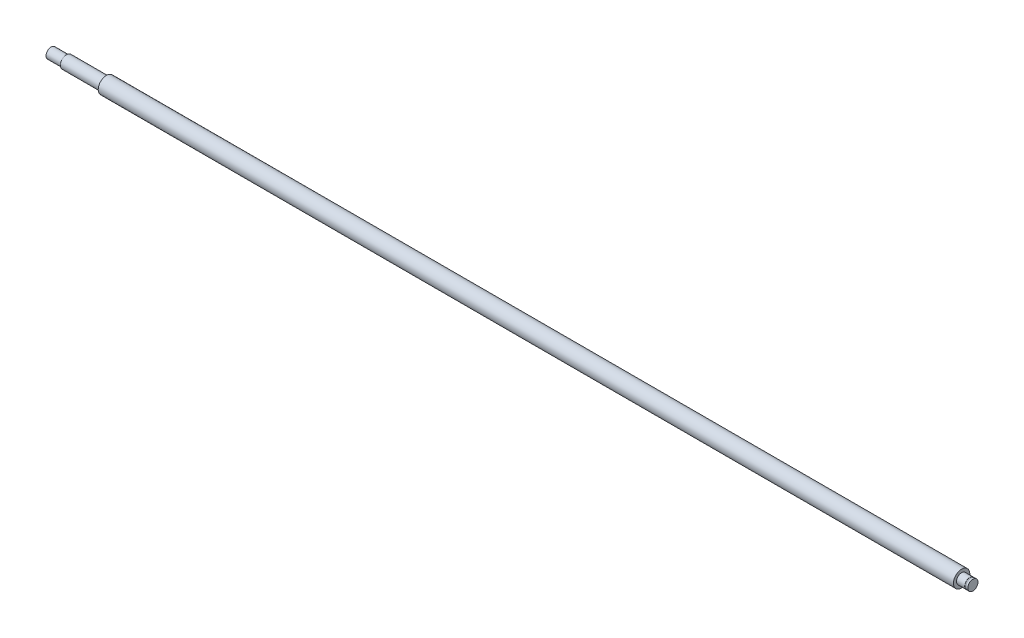
ISO-10303-21;
HEADER;
FILE_DESCRIPTION(('STEP AP214'),'2;1');
FILE_NAME('part.step','',(''),(''),'','','');
FILE_SCHEMA(('AUTOMOTIVE_DESIGN { 1 0 10303 214 1 1 1 1 }'));
ENDSEC;
DATA;
#1=APPLICATION_CONTEXT('core data for automotive mechanical design processes');
#2=APPLICATION_PROTOCOL_DEFINITION('international standard','automotive_design',2000,#1);
#3=PRODUCT_CONTEXT('',#1,'mechanical');
#4=PRODUCT('Part','Part','',(#3));
#5=PRODUCT_RELATED_PRODUCT_CATEGORY('part','',(#4));
#6=PRODUCT_DEFINITION_FORMATION('','',#4);
#7=PRODUCT_DEFINITION_CONTEXT('part definition',#1,'design');
#8=PRODUCT_DEFINITION('design','',#6,#7);
#9=PRODUCT_DEFINITION_SHAPE('','',#8);
#10=(LENGTH_UNIT() NAMED_UNIT(*) SI_UNIT(.MILLI.,.METRE.));
#11=(NAMED_UNIT(*) PLANE_ANGLE_UNIT() SI_UNIT($,.RADIAN.));
#12=(NAMED_UNIT(*) SI_UNIT($,.STERADIAN.) SOLID_ANGLE_UNIT());
#13=UNCERTAINTY_MEASURE_WITH_UNIT(LENGTH_MEASURE(1.E-05),#10,'distance_accuracy_value','');
#14=(GEOMETRIC_REPRESENTATION_CONTEXT(3) GLOBAL_UNCERTAINTY_ASSIGNED_CONTEXT((#13)) GLOBAL_UNIT_ASSIGNED_CONTEXT((#10,
#11,#12)) REPRESENTATION_CONTEXT('',''));
#15=CARTESIAN_POINT('',(0.,0.,0.));
#16=DIRECTION('',(0.,0.,1.));
#17=DIRECTION('',(1.,0.,0.));
#18=AXIS2_PLACEMENT_3D('',#15,#16,#17);
#19=CARTESIAN_POINT('',(0.,0.,0.));
#20=DIRECTION('',(1.,0.,0.));
#21=DIRECTION('',(0.,0.,-1.));
#22=AXIS2_PLACEMENT_3D('',#19,#20,#21);
#23=PLANE('',#22);
#24=CARTESIAN_POINT('',(0.,0.,0.));
#25=DIRECTION('',(-1.,0.,0.));
#26=DIRECTION('',(0.,0.,1.));
#27=AXIS2_PLACEMENT_3D('',#24,#25,#26);
#28=CIRCLE('',#27,5.);
#29=CARTESIAN_POINT('',(0.,0.,5.));
#30=VERTEX_POINT('',#29);
#31=EDGE_CURVE('E10',#30,#30,#28,.T.);
#32=ORIENTED_EDGE('',*,*,#31,.T.);
#33=EDGE_LOOP('',(#32));
#34=FACE_BOUND('',#33,.T.);
#35=ADVANCED_FACE('F39',(#34),#23,.F.);
#36=CARTESIAN_POINT('',(0.,0.,0.));
#37=DIRECTION('',(-1.,0.,0.));
#38=DIRECTION('',(0.,0.,1.));
#39=AXIS2_PLACEMENT_3D('',#36,#37,#38);
#40=CYLINDRICAL_SURFACE('',#39,5.);
#41=ORIENTED_EDGE('',*,*,#31,.F.);
#42=EDGE_LOOP('',(#41));
#43=FACE_BOUND('',#42,.T.);
#44=CARTESIAN_POINT('',(15.,0.,0.));
#45=DIRECTION('',(-1.,0.,0.));
#46=DIRECTION('',(0.,0.,1.));
#47=AXIS2_PLACEMENT_3D('',#44,#45,#46);
#48=CIRCLE('',#47,5.);
#49=CARTESIAN_POINT('',(15.,0.,5.));
#50=VERTEX_POINT('',#49);
#51=EDGE_CURVE('E45',#50,#50,#48,.T.);
#52=ORIENTED_EDGE('',*,*,#51,.T.);
#53=EDGE_LOOP('',(#52));
#54=FACE_BOUND('',#53,.T.);
#55=ADVANCED_FACE('F95',(#43,#54),#40,.T.);
#56=CARTESIAN_POINT('',(15.,5.,0.));
#57=DIRECTION('',(1.,0.,0.));
#58=DIRECTION('',(0.,0.,-1.));
#59=AXIS2_PLACEMENT_3D('',#56,#57,#58);
#60=PLANE('',#59);
#61=ORIENTED_EDGE('',*,*,#51,.F.);
#62=EDGE_LOOP('',(#61));
#63=FACE_BOUND('',#62,.T.);
#64=CARTESIAN_POINT('',(15.,0.,0.));
#65=DIRECTION('',(-1.,0.,0.));
#66=DIRECTION('',(0.,0.,1.));
#67=AXIS2_PLACEMENT_3D('',#64,#65,#66);
#68=CIRCLE('',#67,6.);
#69=CARTESIAN_POINT('',(15.,0.,6.));
#70=VERTEX_POINT('',#69);
#71=EDGE_CURVE('E49',#70,#70,#68,.T.);
#72=ORIENTED_EDGE('',*,*,#71,.T.);
#73=EDGE_LOOP('',(#72));
#74=FACE_BOUND('',#73,.T.);
#75=ADVANCED_FACE('F99',(#63,#74),#60,.F.);
#76=CARTESIAN_POINT('',(0.,0.,0.));
#77=DIRECTION('',(-1.,0.,0.));
#78=DIRECTION('',(0.,0.,1.));
#79=AXIS2_PLACEMENT_3D('',#76,#77,#78);
#80=CYLINDRICAL_SURFACE('',#79,6.);
#81=ORIENTED_EDGE('',*,*,#71,.F.);
#82=EDGE_LOOP('',(#81));
#83=FACE_BOUND('',#82,.T.);
#84=CARTESIAN_POINT('',(54.,0.,0.));
#85=DIRECTION('',(-1.,0.,0.));
#86=DIRECTION('',(0.,0.,1.));
#87=AXIS2_PLACEMENT_3D('',#84,#85,#86);
#88=CIRCLE('',#87,6.);
#89=CARTESIAN_POINT('',(54.,0.,6.));
#90=VERTEX_POINT('',#89);
#91=EDGE_CURVE('E53',#90,#90,#88,.T.);
#92=ORIENTED_EDGE('',*,*,#91,.T.);
#93=EDGE_LOOP('',(#92));
#94=FACE_BOUND('',#93,.T.);
#95=ADVANCED_FACE('F104',(#83,#94),#80,.T.);
#96=CARTESIAN_POINT('',(54.,6.,0.));
#97=DIRECTION('',(1.,0.,0.));
#98=DIRECTION('',(0.,0.,-1.));
#99=AXIS2_PLACEMENT_3D('',#96,#97,#98);
#100=PLANE('',#99);
#101=ORIENTED_EDGE('',*,*,#91,.F.);
#102=EDGE_LOOP('',(#101));
#103=FACE_BOUND('',#102,.T.);
#104=CARTESIAN_POINT('',(54.,0.,0.));
#105=DIRECTION('',(-1.,0.,0.));
#106=DIRECTION('',(0.,0.,1.));
#107=AXIS2_PLACEMENT_3D('',#104,#105,#106);
#108=CIRCLE('',#107,8.);
#109=CARTESIAN_POINT('',(54.,0.,8.));
#110=VERTEX_POINT('',#109);
#111=EDGE_CURVE('E58',#110,#110,#108,.T.);
#112=ORIENTED_EDGE('',*,*,#111,.T.);
#113=EDGE_LOOP('',(#112));
#114=FACE_BOUND('',#113,.T.);
#115=ADVANCED_FACE('F110',(#103,#114),#100,.F.);
#116=CARTESIAN_POINT('',(0.,0.,0.));
#117=DIRECTION('',(-1.,0.,0.));
#118=DIRECTION('',(0.,0.,1.));
#119=AXIS2_PLACEMENT_3D('',#116,#117,#118);
#120=CYLINDRICAL_SURFACE('',#119,8.);
#121=ORIENTED_EDGE('',*,*,#111,.F.);
#122=EDGE_LOOP('',(#121));
#123=FACE_BOUND('',#122,.T.);
#124=CARTESIAN_POINT('',(889.,0.,0.));
#125=DIRECTION('',(-1.,0.,0.));
#126=DIRECTION('',(0.,0.,1.));
#127=AXIS2_PLACEMENT_3D('',#124,#125,#126);
#128=CIRCLE('',#127,8.);
#129=CARTESIAN_POINT('',(889.,0.,8.));
#130=VERTEX_POINT('',#129);
#131=EDGE_CURVE('E61',#130,#130,#128,.T.);
#132=ORIENTED_EDGE('',*,*,#131,.T.);
#133=EDGE_LOOP('',(#132));
#134=FACE_BOUND('',#133,.T.);
#135=ADVANCED_FACE('F114',(#123,#134),#120,.T.);
#136=CARTESIAN_POINT('',(889.,8.,0.));
#137=DIRECTION('',(-1.,0.,0.));
#138=DIRECTION('',(0.,0.,1.));
#139=AXIS2_PLACEMENT_3D('',#136,#137,#138);
#140=PLANE('',#139);
#141=ORIENTED_EDGE('',*,*,#131,.F.);
#142=EDGE_LOOP('',(#141));
#143=FACE_BOUND('',#142,.T.);
#144=CARTESIAN_POINT('',(889.,0.,0.));
#145=DIRECTION('',(-1.,0.,0.));
#146=DIRECTION('',(0.,0.,1.));
#147=AXIS2_PLACEMENT_3D('',#144,#145,#146);
#148=CIRCLE('',#147,5.);
#149=CARTESIAN_POINT('',(889.,0.,5.));
#150=VERTEX_POINT('',#149);
#151=EDGE_CURVE('E64',#150,#150,#148,.T.);
#152=ORIENTED_EDGE('',*,*,#151,.T.);
#153=EDGE_LOOP('',(#152));
#154=FACE_BOUND('',#153,.T.);
#155=ADVANCED_FACE('F118',(#143,#154),#140,.F.);
#156=CARTESIAN_POINT('',(0.,0.,0.));
#157=DIRECTION('',(-1.,0.,0.));
#158=DIRECTION('',(0.,0.,1.));
#159=AXIS2_PLACEMENT_3D('',#156,#157,#158);
#160=CYLINDRICAL_SURFACE('',#159,5.);
#161=ORIENTED_EDGE('',*,*,#151,.F.);
#162=EDGE_LOOP('',(#161));
#163=FACE_BOUND('',#162,.T.);
#164=CARTESIAN_POINT('',(897.,0.,0.));
#165=DIRECTION('',(-1.,0.,0.));
#166=DIRECTION('',(0.,0.,1.));
#167=AXIS2_PLACEMENT_3D('',#164,#165,#166);
#168=CIRCLE('',#167,5.);
#169=CARTESIAN_POINT('',(897.,0.,5.));
#170=VERTEX_POINT('',#169);
#171=EDGE_CURVE('E67',#170,#170,#168,.T.);
#172=ORIENTED_EDGE('',*,*,#171,.T.);
#173=EDGE_LOOP('',(#172));
#174=FACE_BOUND('',#173,.T.);
#175=ADVANCED_FACE('F122',(#163,#174),#160,.T.);
#176=CARTESIAN_POINT('',(897.,5.,0.));
#177=DIRECTION('',(-1.,0.,0.));
#178=DIRECTION('',(0.,0.,1.));
#179=AXIS2_PLACEMENT_3D('',#176,#177,#178);
#180=PLANE('',#179);
#181=ORIENTED_EDGE('',*,*,#171,.F.);
#182=EDGE_LOOP('',(#181));
#183=FACE_BOUND('',#182,.T.);
#184=CARTESIAN_POINT('',(897.,0.,0.));
#185=DIRECTION('',(-1.,0.,0.));
#186=DIRECTION('',(0.,0.,1.));
#187=AXIS2_PLACEMENT_3D('',#184,#185,#186);
#188=CIRCLE('',#187,4.8);
#189=CARTESIAN_POINT('',(897.,0.,4.8));
#190=VERTEX_POINT('',#189);
#191=EDGE_CURVE('E70',#190,#190,#188,.T.);
#192=ORIENTED_EDGE('',*,*,#191,.T.);
#193=EDGE_LOOP('',(#192));
#194=FACE_BOUND('',#193,.T.);
#195=ADVANCED_FACE('F126',(#183,#194),#180,.F.);
#196=CARTESIAN_POINT('',(0.,0.,0.));
#197=DIRECTION('',(-1.,0.,0.));
#198=DIRECTION('',(0.,0.,1.));
#199=AXIS2_PLACEMENT_3D('',#196,#197,#198);
#200=CYLINDRICAL_SURFACE('',#199,4.8);
#201=ORIENTED_EDGE('',*,*,#191,.F.);
#202=EDGE_LOOP('',(#201));
#203=FACE_BOUND('',#202,.T.);
#204=CARTESIAN_POINT('',(898.15,0.,0.));
#205=DIRECTION('',(-1.,0.,0.));
#206=DIRECTION('',(0.,0.,1.));
#207=AXIS2_PLACEMENT_3D('',#204,#205,#206);
#208=CIRCLE('',#207,4.8);
#209=CARTESIAN_POINT('',(898.15,0.,4.8));
#210=VERTEX_POINT('',#209);
#211=EDGE_CURVE('E73',#210,#210,#208,.T.);
#212=ORIENTED_EDGE('',*,*,#211,.T.);
#213=EDGE_LOOP('',(#212));
#214=FACE_BOUND('',#213,.T.);
#215=ADVANCED_FACE('F130',(#203,#214),#200,.T.);
#216=CARTESIAN_POINT('',(898.15,4.8,0.));
#217=DIRECTION('',(1.,0.,0.));
#218=DIRECTION('',(0.,0.,-1.));
#219=AXIS2_PLACEMENT_3D('',#216,#217,#218);
#220=PLANE('',#219);
#221=ORIENTED_EDGE('',*,*,#211,.F.);
#222=EDGE_LOOP('',(#221));
#223=FACE_BOUND('',#222,.T.);
#224=CARTESIAN_POINT('',(898.15,0.,0.));
#225=DIRECTION('',(-1.,0.,0.));
#226=DIRECTION('',(0.,0.,1.));
#227=AXIS2_PLACEMENT_3D('',#224,#225,#226);
#228=CIRCLE('',#227,5.);
#229=CARTESIAN_POINT('',(898.15,0.,5.));
#230=VERTEX_POINT('',#229);
#231=EDGE_CURVE('E76',#230,#230,#228,.T.);
#232=ORIENTED_EDGE('',*,*,#231,.T.);
#233=EDGE_LOOP('',(#232));
#234=FACE_BOUND('',#233,.T.);
#235=ADVANCED_FACE('F91',(#223,#234),#220,.F.);
#236=CARTESIAN_POINT('',(0.,0.,0.));
#237=DIRECTION('',(-1.,0.,0.));
#238=DIRECTION('',(0.,0.,1.));
#239=AXIS2_PLACEMENT_3D('',#236,#237,#238);
#240=CYLINDRICAL_SURFACE('',#239,5.);
#241=ORIENTED_EDGE('',*,*,#231,.F.);
#242=EDGE_LOOP('',(#241));
#243=FACE_BOUND('',#242,.T.);
#244=CARTESIAN_POINT('',(900.,0.,0.));
#245=DIRECTION('',(-1.,0.,0.));
#246=DIRECTION('',(0.,0.,1.));
#247=AXIS2_PLACEMENT_3D('',#244,#245,#246);
#248=CIRCLE('',#247,5.);
#249=CARTESIAN_POINT('',(900.,0.,5.));
#250=VERTEX_POINT('',#249);
#251=EDGE_CURVE('E79',#250,#250,#248,.T.);
#252=ORIENTED_EDGE('',*,*,#251,.T.);
#253=EDGE_LOOP('',(#252));
#254=FACE_BOUND('',#253,.T.);
#255=ADVANCED_FACE('F83',(#243,#254),#240,.T.);
#256=CARTESIAN_POINT('',(900.,5.,0.));
#257=DIRECTION('',(-1.,0.,0.));
#258=DIRECTION('',(0.,0.,1.));
#259=AXIS2_PLACEMENT_3D('',#256,#257,#258);
#260=PLANE('',#259);
#261=ORIENTED_EDGE('',*,*,#251,.F.);
#262=EDGE_LOOP('',(#261));
#263=FACE_BOUND('',#262,.T.);
#264=ADVANCED_FACE('F85',(#263),#260,.F.);
#265=CLOSED_SHELL('',(#35,#55,#75,#95,#115,#135,#155,#175,#195,#215,#235,#255,#264));
#266=MANIFOLD_SOLID_BREP('B2',#265);
#267=ADVANCED_BREP_SHAPE_REPRESENTATION('',(#18,#266),#14);
#268=SHAPE_DEFINITION_REPRESENTATION(#9,#267);
ENDSEC;
END-ISO-10303-21;
